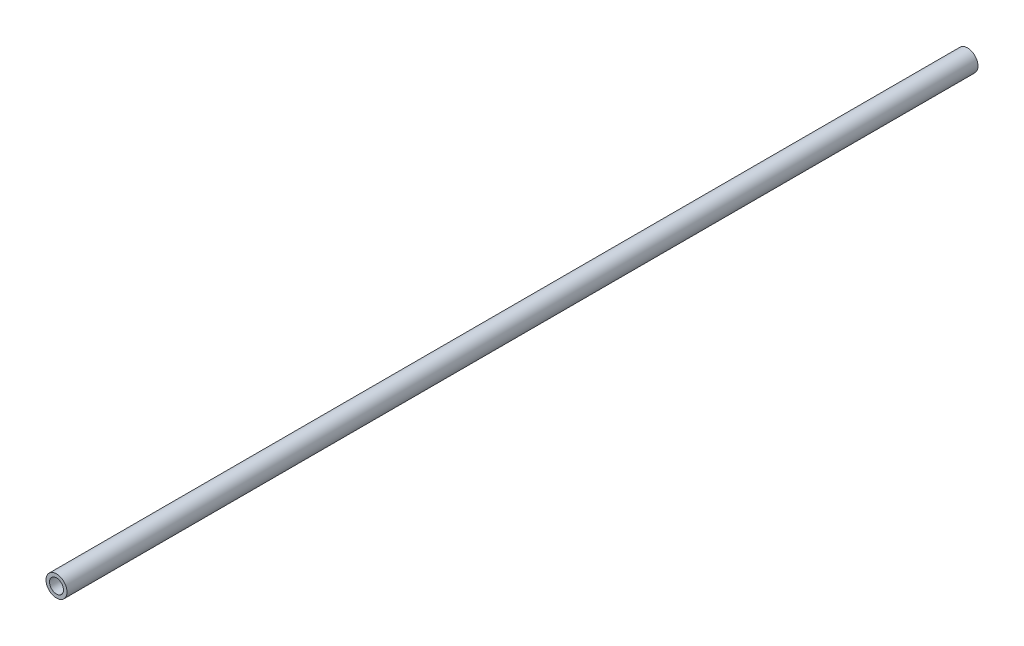
ISO-10303-21;
HEADER;
FILE_DESCRIPTION(('STEP AP214'),'2;1');
FILE_NAME('part.step','',(''),(''),'','','');
FILE_SCHEMA(('AUTOMOTIVE_DESIGN { 1 0 10303 214 1 1 1 1 }'));
ENDSEC;
DATA;
#1=APPLICATION_CONTEXT('core data for automotive mechanical design processes');
#2=APPLICATION_PROTOCOL_DEFINITION('international standard','automotive_design',2000,#1);
#3=PRODUCT_CONTEXT('',#1,'mechanical');
#4=PRODUCT('Part','Part','',(#3));
#5=PRODUCT_RELATED_PRODUCT_CATEGORY('part','',(#4));
#6=PRODUCT_DEFINITION_FORMATION('','',#4);
#7=PRODUCT_DEFINITION_CONTEXT('part definition',#1,'design');
#8=PRODUCT_DEFINITION('design','',#6,#7);
#9=PRODUCT_DEFINITION_SHAPE('','',#8);
#10=(LENGTH_UNIT() NAMED_UNIT(*) SI_UNIT(.MILLI.,.METRE.));
#11=(NAMED_UNIT(*) PLANE_ANGLE_UNIT() SI_UNIT($,.RADIAN.));
#12=(NAMED_UNIT(*) SI_UNIT($,.STERADIAN.) SOLID_ANGLE_UNIT());
#13=UNCERTAINTY_MEASURE_WITH_UNIT(LENGTH_MEASURE(1.E-05),#10,'distance_accuracy_value','');
#14=(GEOMETRIC_REPRESENTATION_CONTEXT(3) GLOBAL_UNCERTAINTY_ASSIGNED_CONTEXT((#13)) GLOBAL_UNIT_ASSIGNED_CONTEXT((#10,
#11,#12)) REPRESENTATION_CONTEXT('',''));
#15=CARTESIAN_POINT('',(0.,0.,0.));
#16=DIRECTION('',(0.,0.,1.));
#17=DIRECTION('',(1.,0.,0.));
#18=AXIS2_PLACEMENT_3D('',#15,#16,#17);
#19=CARTESIAN_POINT('',(0.,0.,260.));
#20=DIRECTION('',(0.,0.,1.));
#21=DIRECTION('',(1.,0.,0.));
#22=AXIS2_PLACEMENT_3D('',#19,#20,#21);
#23=PLANE('',#22);
#24=CARTESIAN_POINT('',(0.,0.,260.));
#25=DIRECTION('',(0.,0.,1.));
#26=DIRECTION('',(1.,0.,0.));
#27=AXIS2_PLACEMENT_3D('',#24,#25,#26);
#28=CIRCLE('',#27,3.);
#29=CARTESIAN_POINT('',(3.,0.,260.));
#30=VERTEX_POINT('',#29);
#31=EDGE_CURVE('E10',#30,#30,#28,.T.);
#32=ORIENTED_EDGE('',*,*,#31,.T.);
#33=EDGE_LOOP('',(#32));
#34=FACE_BOUND('',#33,.T.);
#35=CARTESIAN_POINT('',(0.,0.,260.));
#36=DIRECTION('',(0.,0.,1.));
#37=DIRECTION('',(1.,0.,0.));
#38=AXIS2_PLACEMENT_3D('',#35,#36,#37);
#39=CIRCLE('',#38,2.);
#40=CARTESIAN_POINT('',(2.,0.,260.));
#41=VERTEX_POINT('',#40);
#42=EDGE_CURVE('E54',#41,#41,#39,.T.);
#43=ORIENTED_EDGE('',*,*,#42,.F.);
#44=EDGE_LOOP('',(#43));
#45=FACE_BOUND('',#44,.T.);
#46=ADVANCED_FACE('F41',(#34,#45),#23,.T.);
#47=CARTESIAN_POINT('',(0.,0.,0.));
#48=DIRECTION('',(0.,0.,1.));
#49=DIRECTION('',(1.,0.,0.));
#50=AXIS2_PLACEMENT_3D('',#47,#48,#49);
#51=PLANE('',#50);
#52=CARTESIAN_POINT('',(0.,0.,0.));
#53=DIRECTION('',(0.,0.,1.));
#54=DIRECTION('',(1.,0.,0.));
#55=AXIS2_PLACEMENT_3D('',#52,#53,#54);
#56=CIRCLE('',#55,3.);
#57=CARTESIAN_POINT('',(3.,0.,0.));
#58=VERTEX_POINT('',#57);
#59=EDGE_CURVE('E45',#58,#58,#56,.T.);
#60=ORIENTED_EDGE('',*,*,#59,.F.);
#61=EDGE_LOOP('',(#60));
#62=FACE_BOUND('',#61,.T.);
#63=CARTESIAN_POINT('',(0.,0.,0.));
#64=DIRECTION('',(0.,0.,1.));
#65=DIRECTION('',(1.,0.,0.));
#66=AXIS2_PLACEMENT_3D('',#63,#64,#65);
#67=CIRCLE('',#66,2.);
#68=CARTESIAN_POINT('',(2.,0.,0.));
#69=VERTEX_POINT('',#68);
#70=EDGE_CURVE('E56',#69,#69,#67,.T.);
#71=ORIENTED_EDGE('',*,*,#70,.T.);
#72=EDGE_LOOP('',(#71));
#73=FACE_BOUND('',#72,.T.);
#74=ADVANCED_FACE('F68',(#62,#73),#51,.F.);
#75=CARTESIAN_POINT('',(0.,0.,260.));
#76=DIRECTION('',(0.,0.,-1.));
#77=DIRECTION('',(-1.,0.,0.));
#78=AXIS2_PLACEMENT_3D('',#75,#76,#77);
#79=CYLINDRICAL_SURFACE('',#78,3.);
#80=ORIENTED_EDGE('',*,*,#31,.F.);
#81=EDGE_LOOP('',(#80));
#82=FACE_BOUND('',#81,.T.);
#83=ORIENTED_EDGE('',*,*,#59,.T.);
#84=EDGE_LOOP('',(#83));
#85=FACE_BOUND('',#84,.T.);
#86=ADVANCED_FACE('F43',(#82,#85),#79,.T.);
#87=CARTESIAN_POINT('',(0.,0.,260.));
#88=DIRECTION('',(0.,0.,-1.));
#89=DIRECTION('',(-1.,0.,0.));
#90=AXIS2_PLACEMENT_3D('',#87,#88,#89);
#91=CYLINDRICAL_SURFACE('',#90,2.);
#92=ORIENTED_EDGE('',*,*,#42,.T.);
#93=EDGE_LOOP('',(#92));
#94=FACE_BOUND('',#93,.T.);
#95=ORIENTED_EDGE('',*,*,#70,.F.);
#96=EDGE_LOOP('',(#95));
#97=FACE_BOUND('',#96,.T.);
#98=ADVANCED_FACE('F64',(#94,#97),#91,.F.);
#99=CLOSED_SHELL('',(#46,#74,#86,#98));
#100=MANIFOLD_SOLID_BREP('B2',#99);
#101=ADVANCED_BREP_SHAPE_REPRESENTATION('',(#18,#100),#14);
#102=SHAPE_DEFINITION_REPRESENTATION(#9,#101);
ENDSEC;
END-ISO-10303-21;
